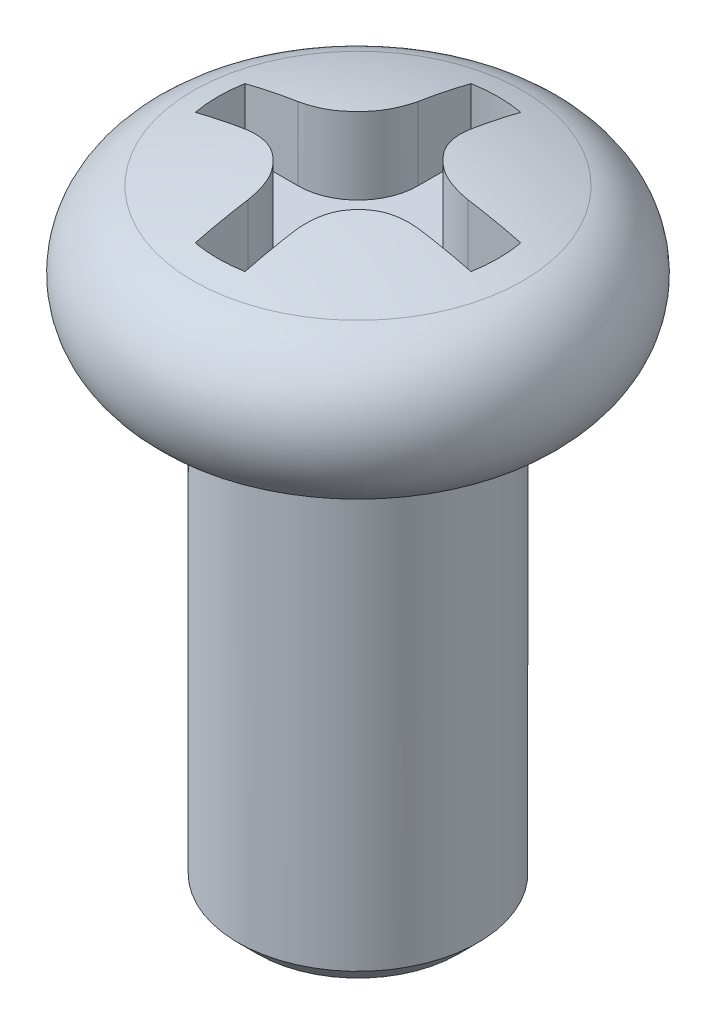
ISO-10303-21;
HEADER;
FILE_DESCRIPTION(('STEP AP214'),'2;1');
FILE_NAME('part.step','',(''),(''),'','','');
FILE_SCHEMA(('AUTOMOTIVE_DESIGN { 1 0 10303 214 1 1 1 1 }'));
ENDSEC;
DATA;
#1=APPLICATION_CONTEXT('core data for automotive mechanical design processes');
#2=APPLICATION_PROTOCOL_DEFINITION('international standard','automotive_design',2000,#1);
#3=PRODUCT_CONTEXT('',#1,'mechanical');
#4=PRODUCT('Part','Part','',(#3));
#5=PRODUCT_RELATED_PRODUCT_CATEGORY('part','',(#4));
#6=PRODUCT_DEFINITION_FORMATION('','',#4);
#7=PRODUCT_DEFINITION_CONTEXT('part definition',#1,'design');
#8=PRODUCT_DEFINITION('design','',#6,#7);
#9=PRODUCT_DEFINITION_SHAPE('','',#8);
#10=(LENGTH_UNIT() NAMED_UNIT(*) SI_UNIT(.MILLI.,.METRE.));
#11=(NAMED_UNIT(*) PLANE_ANGLE_UNIT() SI_UNIT($,.RADIAN.));
#12=(NAMED_UNIT(*) SI_UNIT($,.STERADIAN.) SOLID_ANGLE_UNIT());
#13=UNCERTAINTY_MEASURE_WITH_UNIT(LENGTH_MEASURE(1.E-05),#10,'distance_accuracy_value','');
#14=(GEOMETRIC_REPRESENTATION_CONTEXT(3) GLOBAL_UNCERTAINTY_ASSIGNED_CONTEXT((#13)) GLOBAL_UNIT_ASSIGNED_CONTEXT((#10,
#11,#12)) REPRESENTATION_CONTEXT('',''));
#15=CARTESIAN_POINT('',(0.,0.,0.));
#16=DIRECTION('',(0.,0.,1.));
#17=DIRECTION('',(1.,0.,0.));
#18=AXIS2_PLACEMENT_3D('',#15,#16,#17);
#19=CARTESIAN_POINT('',(0.,-4.9,0.));
#20=DIRECTION('',(0.,-1.,0.));
#21=DIRECTION('',(-1.,0.,0.));
#22=AXIS2_PLACEMENT_3D('',#19,#20,#21);
#23=SPHERICAL_SURFACE('',#22,6.9);
#24=CARTESIAN_POINT('',(0.,1.685838131098,0.));
#25=DIRECTION('',(0.,-1.,0.));
#26=DIRECTION('',(1.,0.,0.));
#27=AXIS2_PLACEMENT_3D('',#24,#25,#26);
#28=CIRCLE('',#27,2.0583333);
#29=CARTESIAN_POINT('',(2.0583333,1.685838131098,0.));
#30=VERTEX_POINT('',#29);
#31=EDGE_CURVE('E202',#30,#30,#28,.T.);
#32=ORIENTED_EDGE('',*,*,#31,.F.);
#33=EDGE_LOOP('',(#32));
#34=FACE_BOUND('',#33,.T.);
#35=CARTESIAN_POINT('',(0.,1.774391358029,0.));
#36=DIRECTION('',(0.,-1.,0.));
#37=DIRECTION('',(0.98411717531384,0.,-0.177520098164429));
#38=AXIS2_PLACEMENT_3D('',#35,#36,#37);
#39=CIRCLE('',#38,1.75);
#40=CARTESIAN_POINT('',(1.722205056801,1.774391358019,-0.3106601717798));
#41=VERTEX_POINT('',#40);
#42=CARTESIAN_POINT('',(1.722205056801,1.774391358019,0.3106601717798));
#43=VERTEX_POINT('',#42);
#44=EDGE_CURVE('E11',#41,#43,#39,.T.);
#45=ORIENTED_EDGE('',*,*,#44,.T.);
#46=CARTESIAN_POINT('',(0.,-4.90000000001,0.3106601717898));
#47=DIRECTION('',(0.,0.,1.));
#48=DIRECTION('',(0.249848296689616,0.968284993502067,0.));
#49=AXIS2_PLACEMENT_3D('',#46,#47,#48);
#50=CIRCLE('',#49,6.893003);
#51=CARTESIAN_POINT('',(1.06066017178,1.910909649795,0.3106601717798));
#52=VERTEX_POINT('',#51);
#53=EDGE_CURVE('E28',#43,#52,#50,.T.);
#54=ORIENTED_EDGE('',*,*,#53,.T.);
#55=CARTESIAN_POINT('',(1.06066017178817,1.9109096497932,0.310660171789263));
#56=CARTESIAN_POINT('',(1.04550870320732,1.91324862458975,0.311111787621939));
#57=CARTESIAN_POINT('',(1.03035536587315,1.91552093768576,0.311893525613119));
#58=CARTESIAN_POINT('',(1.00072540382788,1.91983187100458,0.314097791161661));
#59=CARTESIAN_POINT('',(0.986247474430137,1.92187632437621,0.315491575266336));
#60=CARTESIAN_POINT('',(0.957958898957418,1.92574823588498,0.318863072570291));
#61=CARTESIAN_POINT('',(0.944145807435469,1.92758120480064,0.320813749352214));
#62=CARTESIAN_POINT('',(0.917173875311545,1.93104553982171,0.325254997721349));
#63=CARTESIAN_POINT('',(0.904011515069517,1.93268209941558,0.327720030994574));
#64=CARTESIAN_POINT('',(0.87832295518821,1.93576796378264,0.333155898371454));
#65=CARTESIAN_POINT('',(0.865792279041803,1.93722212794882,0.336102708871264));
#66=CARTESIAN_POINT('',(0.841344070084947,1.93995644697999,0.342478129191438));
#67=CARTESIAN_POINT('',(0.829421234436119,1.94124109577703,0.345884380665194));
#68=CARTESIAN_POINT('',(0.806160237493415,1.94364855747499,0.3531639830369));
#69=CARTESIAN_POINT('',(0.794816156086996,1.94477544280584,0.35701698968363));
#70=CARTESIAN_POINT('',(0.772678127746766,1.94687849678631,0.365183955471231));
#71=CARTESIAN_POINT('',(0.761877982776778,1.94785823003055,0.369480134767831));
#72=CARTESIAN_POINT('',(0.740786369598739,1.94967707488655,0.378534906746319));
#73=CARTESIAN_POINT('',(0.730488947659178,1.95051912353703,0.383279002369331));
#74=CARTESIAN_POINT('',(0.710353384605326,1.9520717023793,0.393237627300516));
#75=CARTESIAN_POINT('',(0.700510258390167,1.9527843940926,0.398441722660219));
#76=CARTESIAN_POINT('',(0.681224835273873,1.9540863929173,0.409333848356008));
#77=CARTESIAN_POINT('',(0.671779396137265,1.95467692749977,0.415016166047504));
#78=CARTESIAN_POINT('',(0.653220654134605,1.95574178825182,0.426882584257356));
#79=CARTESIAN_POINT('',(0.644106921643997,1.95621626964906,0.433065999618065));
#80=CARTESIAN_POINT('',(0.6261318658096,1.95705517853008,0.445955968670018));
#81=CARTESIAN_POINT('',(0.617273441085499,1.95741860893671,0.45266661861116));
#82=CARTESIAN_POINT('',(0.599716795320436,1.95804059516741,0.466634001691271));
#83=CARTESIAN_POINT('',(0.591024880657963,1.95829701176932,0.473898725523823));
#84=CARTESIAN_POINT('',(0.573698973283935,1.95870862426126,0.489000456929484));
#85=CARTESIAN_POINT('',(0.565074133006807,1.95886063560617,0.496847994016686));
#86=CARTESIAN_POINT('',(0.547759027211177,1.95906722149787,0.513131149072098));
#87=CARTESIAN_POINT('',(0.539079140264948,1.95911779880955,0.521577772810033));
#88=CARTESIAN_POINT('',(0.522223726113186,1.95911845324368,0.538436616029811));
#89=CARTESIAN_POINT('',(0.514040924167903,1.95907164587777,0.546841538384985));
#90=CARTESIAN_POINT('',(0.498286766063232,1.95887072332485,0.563676342707573));
#91=CARTESIAN_POINT('',(0.49070407259443,1.958720326036,0.572095577078988));
#92=CARTESIAN_POINT('',(0.476112251744303,1.95831251253911,0.589057461349643));
#93=CARTESIAN_POINT('',(0.469093588667021,1.95805782843146,0.597591940633899));
#94=CARTESIAN_POINT('',(0.455596703912735,1.95743939861879,0.614878142768779));
#95=CARTESIAN_POINT('',(0.449112152870233,1.95707727703771,0.623624964317576));
#96=CARTESIAN_POINT('',(0.436646290125789,1.95624129930515,0.641414800350118));
#97=CARTESIAN_POINT('',(0.430663121190871,1.95576788271336,0.650456532089738));
#98=CARTESIAN_POINT('',(0.419163970664759,1.95470544636917,0.66890506016509));
#99=CARTESIAN_POINT('',(0.413651164909979,1.95411571810024,0.678313795265114));
#100=CARTESIAN_POINT('',(0.403059406441995,1.95281560296707,0.697555977344867));
#101=CARTESIAN_POINT('',(0.397988551103728,1.95210347942657,0.7073937574467));
#102=CARTESIAN_POINT('',(0.388252298114528,1.95055222672741,0.727545960522783));
#103=CARTESIAN_POINT('',(0.383599289917111,1.94971049738361,0.737866152949614));
#104=CARTESIAN_POINT('',(0.374676824706521,1.94789237566674,0.759028293380499));
#105=CARTESIAN_POINT('',(0.370423157610175,1.94691268883952,0.769876591609235));
#106=CARTESIAN_POINT('',(0.362285111445842,1.94480969492859,0.792133948715132));
#107=CARTESIAN_POINT('',(0.358419015033906,1.94368254480411,0.803549300865503));
#108=CARTESIAN_POINT('',(0.351050231439664,1.94127440414978,0.826974208933473));
#109=CARTESIAN_POINT('',(0.347567560938652,1.93998913187359,0.838989592325659));
#110=CARTESIAN_POINT('',(0.340968617672086,1.93725330569677,0.863642930407083));
#111=CARTESIAN_POINT('',(0.337873560688332,1.93579810507451,0.876286021306659));
#112=CARTESIAN_POINT('',(0.332061955673466,1.9327098042312,0.902218478786069));
#113=CARTESIAN_POINT('',(0.32936751404072,1.93107173622393,0.915512184137327));
#114=CARTESIAN_POINT('',(0.324378756877738,1.92760392138918,0.942765366998293));
#115=CARTESIAN_POINT('',(0.322107333345456,1.92576890679366,0.956728346354404));
#116=CARTESIAN_POINT('',(0.317995179547716,1.92189235110058,0.98533534072101));
#117=CARTESIAN_POINT('',(0.316178140485245,1.91984525149653,0.999981987317798));
#118=CARTESIAN_POINT('',(0.313017210390912,1.91552835783761,1.02996879904873));
#119=CARTESIAN_POINT('',(0.311698056950179,1.91325270230791,1.04531074049405));
#120=CARTESIAN_POINT('',(0.310660171789266,1.9109096497932,1.06066017178817));
#121=B_SPLINE_CURVE_WITH_KNOTS('',3,(#55,#56,#57,#58,#59,#60,#61,#62,#63,#64,#65,#66,#67,#68,
#69,#70,#71,#72,#73,#74,#75,#76,#77,#78,#79,#80,#81,#82,#83,#84,#85,#86,#87,#88,#89,#90,#91,#92,
#93,#94,#95,#96,#97,#98,#99,#100,#101,#102,#103,#104,#105,#106,#107,#108,#109,#110,#111,#112,
#113,#114,#115,#116,#117,#118,#119,#120),.UNSPECIFIED.,.F.,.F.,(4,2,2,2,2,2,2,2,2,2,2,2,2,2,2,2,
2,2,2,2,2,2,2,2,2,2,2,2,2,2,2,2,4),(0.,0.0460110378276426,0.0900602395785725,0.132256060055777,
0.1727144070444,0.211563202319611,0.248947053682671,0.285031854204781,0.320008997112121,
0.35409874668017,0.387552182372905,0.420651112884498,0.453705526596246,0.487048545807975,
0.521029408986188,0.556005515994399,0.59233480283093,0.627519739151055,0.661503508456022,
0.694648776266983,0.727316517114937,0.75985734228012,0.792602879788762,0.825858581197161,
0.859898930887623,0.894965400264535,0.931266904252637,0.968982167585572,1.00826331894341,
1.04924012003679,1.092024400231,1.13671443071602,1.18339910029144),.UNSPECIFIED.);
#122=CARTESIAN_POINT('',(0.3106601717798,1.910909649795,1.06066017178));
#123=VERTEX_POINT('',#122);
#124=EDGE_CURVE('E254',#52,#123,#121,.T.);
#125=ORIENTED_EDGE('',*,*,#124,.T.);
#126=CARTESIAN_POINT('',(0.3106601717898,-4.90000000001,0.));
#127=DIRECTION('',(1.,0.,0.));
#128=DIRECTION('',(0.,0.988090336967111,0.153874903711495));
#129=AXIS2_PLACEMENT_3D('',#126,#127,#128);
#130=CIRCLE('',#129,6.893003);
#131=CARTESIAN_POINT('',(0.3106601717798,1.774391358019,1.722205056801));
#132=VERTEX_POINT('',#131);
#133=EDGE_CURVE('E238',#123,#132,#130,.T.);
#134=ORIENTED_EDGE('',*,*,#133,.T.);
#135=CARTESIAN_POINT('',(0.,1.774391358029,0.));
#136=DIRECTION('',(0.,-1.,0.));
#137=DIRECTION('',(0.177520098164429,0.,0.98411717531384));
#138=AXIS2_PLACEMENT_3D('',#135,#136,#137);
#139=CIRCLE('',#138,1.75);
#140=CARTESIAN_POINT('',(-0.3106601717798,1.774391358019,1.722205056801));
#141=VERTEX_POINT('',#140);
#142=EDGE_CURVE('E234',#132,#141,#139,.T.);
#143=ORIENTED_EDGE('',*,*,#142,.T.);
#144=CARTESIAN_POINT('',(-0.3106601717898,-4.90000000001,0.));
#145=DIRECTION('',(-1.,0.,0.));
#146=DIRECTION('',(0.,0.968284993502067,0.249848296689616));
#147=AXIS2_PLACEMENT_3D('',#144,#145,#146);
#148=CIRCLE('',#147,6.893003);
#149=CARTESIAN_POINT('',(-0.3106601717798,1.910909649795,1.06066017178));
#150=VERTEX_POINT('',#149);
#151=EDGE_CURVE('E239',#141,#150,#148,.T.);
#152=ORIENTED_EDGE('',*,*,#151,.T.);
#153=CARTESIAN_POINT('',(-0.310660171789267,1.9109096497932,1.06066017178817));
#154=CARTESIAN_POINT('',(-0.311188959712345,1.91324896499424,1.04548390526636));
#155=CARTESIAN_POINT('',(-0.312041539827203,1.91552149928511,1.03030723466459));
#156=CARTESIAN_POINT('',(-0.314372077221455,1.91983282318091,1.00063316848176));
#157=CARTESIAN_POINT('',(-0.315821831353506,1.92187744705781,0.986134390865545));
#158=CARTESIAN_POINT('',(-0.319291452112784,1.92574965317296,0.95780646007031));
#159=CARTESIAN_POINT('',(-0.321284731114342,1.92758275001018,0.943974826492366));
#160=CARTESIAN_POINT('',(-0.325798908226802,1.93104729519845,0.916968050413905));
#161=CARTESIAN_POINT('',(-0.328294620733991,1.93268394457546,0.90378938381432));
#162=CARTESIAN_POINT('',(-0.333780983965999,1.93576994307483,0.87807046099126));
#163=CARTESIAN_POINT('',(-0.33674786441688,1.9372241639117,0.865525742018178));
#164=CARTESIAN_POINT('',(-0.343153870053884,1.93995854925479,0.841051799416627));
#165=CARTESIAN_POINT('',(-0.346570785680732,1.9412432261917,0.829117291903155));
#166=CARTESIAN_POINT('',(-0.353863364348708,1.94365069369274,0.80583548873411));
#167=CARTESIAN_POINT('',(-0.357718723147978,1.94477758296721,0.794482282697906));
#168=CARTESIAN_POINT('',(-0.365883143588718,1.94688058875411,0.772328806026146));
#169=CARTESIAN_POINT('',(-0.370174355961316,1.94786030554355,0.76152232228317));
#170=CARTESIAN_POINT('',(-0.379212948188262,1.94967905377784,0.740421171798701));
#171=CARTESIAN_POINT('',(-0.383945659036373,1.95052106854347,0.730120496388603));
#172=CARTESIAN_POINT('',(-0.393876175416661,1.95207350655421,0.709981983354731));
#173=CARTESIAN_POINT('',(-0.399063290836236,1.95278614835346,0.700139054866896));
#174=CARTESIAN_POINT('',(-0.409916920659951,1.95408796538572,0.680858071530588));
#175=CARTESIAN_POINT('',(-0.415577413729547,1.95467843430211,0.671416716362742));
#176=CARTESIAN_POINT('',(-0.427396368067784,1.95574307200828,0.652870761102481));
#177=CARTESIAN_POINT('',(-0.433553825350038,1.95621746784146,0.643765533655578));
#178=CARTESIAN_POINT('',(-0.446388634746637,1.9570561174188,0.625812683999315));
#179=CARTESIAN_POINT('',(-0.453069799486907,1.95741944635292,0.616967751061776));
#180=CARTESIAN_POINT('',(-0.466975709447833,1.9580411143769,0.599444149195068));
#181=CARTESIAN_POINT('',(-0.474208239360027,1.95829738077092,0.590771608493482));
#182=CARTESIAN_POINT('',(-0.489242903961644,1.95870869273976,0.573490552519557));
#183=CARTESIAN_POINT('',(-0.497055440351344,1.95886061360104,0.564891059941781));
#184=CARTESIAN_POINT('',(-0.513269250700217,1.95906660303295,0.547636286436078));
#185=CARTESIAN_POINT('',(-0.521681613602266,1.95911670599317,0.538991455897039));
#186=CARTESIAN_POINT('',(-0.538571460417978,1.95911768127167,0.522097027638848));
#187=CARTESIAN_POINT('',(-0.547044521074045,1.95907045827474,0.513843016916012));
#188=CARTESIAN_POINT('',(-0.56399876143187,1.95886899341761,0.497947572320779));
#189=CARTESIAN_POINT('',(-0.572469283228695,1.95871855400853,0.49029480975597));
#190=CARTESIAN_POINT('',(-0.589521670931856,1.95831048507428,0.475568249656966));
#191=CARTESIAN_POINT('',(-0.59809508439007,1.95805570890199,0.468484628581978));
#192=CARTESIAN_POINT('',(-0.61544809320584,1.95743700946711,0.454863885615258));
#193=CARTESIAN_POINT('',(-0.624222401774775,1.95707484692545,0.448319973267337));
#194=CARTESIAN_POINT('',(-0.642057759032678,1.95623865863534,0.435742951941135));
#195=CARTESIAN_POINT('',(-0.651117104272223,1.95576521675466,0.429707392920342));
#196=CARTESIAN_POINT('',(-0.669592513013881,1.95470260623423,0.418112272203229));
#197=CARTESIAN_POINT('',(-0.679010137324107,1.95411286925276,0.412555248845126));
#198=CARTESIAN_POINT('',(-0.698262685378216,1.95281262136386,0.401885167156466));
#199=CARTESIAN_POINT('',(-0.708101656304477,1.95210050003572,0.396779616806807));
#200=CARTESIAN_POINT('',(-0.728249568391864,1.95054915655108,0.386985405622301));
#201=CARTESIAN_POINT('',(-0.738564101287168,1.94970744067116,0.382308671875041));
#202=CARTESIAN_POINT('',(-0.759708866785122,1.94788927485507,0.373351596663143));
#203=CARTESIAN_POINT('',(-0.770545370238492,1.94690961535292,0.369086762829485));
#204=CARTESIAN_POINT('',(-0.792773604774974,1.94480663004744,0.360940770248744));
#205=CARTESIAN_POINT('',(-0.804171623252446,1.94367952585863,0.357077817335521));
#206=CARTESIAN_POINT('',(-0.827556777049572,1.94127145393799,0.349731436870132));
#207=CARTESIAN_POINT('',(-0.839549778045758,1.93998625185881,0.346268158862058));
#208=CARTESIAN_POINT('',(-0.864153632900593,1.93725056276809,0.339726060043669));
#209=CARTESIAN_POINT('',(-0.876769677308417,1.9357954625907,0.336668789293999));
#210=CARTESIAN_POINT('',(-0.90264360191056,1.93270737593054,0.330952994968485));
#211=CARTESIAN_POINT('',(-0.9159058671021,1.93106944447769,0.328317100461364));
#212=CARTESIAN_POINT('',(-0.943091898136948,1.9276019304221,0.323468092772859));
#213=CARTESIAN_POINT('',(-0.957019183113387,1.92576709464389,0.321278569545032));
#214=CARTESIAN_POINT('',(-0.98555054505602,1.92189093524492,0.317355556253512));
#215=CARTESIAN_POINT('',(-1.00015722313923,1.91984406124985,0.315646621982165));
#216=CARTESIAN_POINT('',(-1.03005971711726,1.91552767327938,0.312730083833179));
#217=CARTESIAN_POINT('',(-1.04535721296255,1.91325230108314,0.31154823924848));
#218=CARTESIAN_POINT('',(-1.06066017178817,1.9109096497932,0.310660171789262));
#219=B_SPLINE_CURVE_WITH_KNOTS('',3,(#153,#154,#155,#156,#157,#158,#159,#160,#161,#162,#163,
#164,#165,#166,#167,#168,#169,#170,#171,#172,#173,#174,#175,#176,#177,#178,#179,#180,#181,#182,
#183,#184,#185,#186,#187,#188,#189,#190,#191,#192,#193,#194,#195,#196,#197,#198,#199,#200,#201,
#202,#203,#204,#205,#206,#207,#208,#209,#210,#211,#212,#213,#214,#215,#216,#217,#218),
.UNSPECIFIED.,.F.,.F.,(4,2,2,2,2,2,2,2,2,2,2,2,2,2,2,2,2,2,2,2,2,2,2,2,2,2,2,2,2,2,2,2,4),(0.,
0.0460921786748148,0.0902198498512771,0.132488705002184,0.173012160610234,0.211915867973418,
0.249342345064399,0.285455552834279,0.320445110356938,0.35452969285542,0.387959027994639,
0.421013876330516,0.454003541733871,0.487260852899496,0.521135118579409,0.555984085799017,
0.592166182179417,0.627646915995433,0.661886164147461,0.6952457010258,0.728085961939722,
0.760757616351991,0.79359308354668,0.826899346063419,0.860953061358756,0.895998366725662,
0.932247189387749,0.969881506793647,1.00905689084824,1.04990674208378,1.09254677446084,
1.1370794723804,1.18359837042956),.UNSPECIFIED.);
#220=CARTESIAN_POINT('',(-1.06066017178,1.910909649795,0.3106601717798));
#221=VERTEX_POINT('',#220);
#222=EDGE_CURVE('E575',#150,#221,#219,.T.);
#223=ORIENTED_EDGE('',*,*,#222,.T.);
#224=CARTESIAN_POINT('',(0.,-4.90000000001,0.3106601717898));
#225=DIRECTION('',(0.,0.,1.));
#226=DIRECTION('',(-0.153874903711495,0.988090336967111,0.));
#227=AXIS2_PLACEMENT_3D('',#224,#225,#226);
#228=CIRCLE('',#227,6.893003);
#229=CARTESIAN_POINT('',(-1.722205056801,1.774391358019,0.3106601717798));
#230=VERTEX_POINT('',#229);
#231=EDGE_CURVE('E139',#221,#230,#228,.T.);
#232=ORIENTED_EDGE('',*,*,#231,.T.);
#233=CARTESIAN_POINT('',(0.,1.774391358029,0.));
#234=DIRECTION('',(0.,-1.,0.));
#235=DIRECTION('',(-1.,0.,0.));
#236=AXIS2_PLACEMENT_3D('',#233,#234,#235);
#237=CIRCLE('',#236,1.75);
#238=CARTESIAN_POINT('',(-1.722205056801,1.774391358019,-0.3106601717798));
#239=VERTEX_POINT('',#238);
#240=EDGE_CURVE('E433',#230,#239,#237,.T.);
#241=ORIENTED_EDGE('',*,*,#240,.T.);
#242=CARTESIAN_POINT('',(0.,-4.90000000001,-0.3106601717898));
#243=DIRECTION('',(0.,0.,-1.));
#244=DIRECTION('',(-0.249848296689616,0.968284993502067,0.));
#245=AXIS2_PLACEMENT_3D('',#242,#243,#244);
#246=CIRCLE('',#245,6.893003);
#247=CARTESIAN_POINT('',(-1.06066017178,1.910909649795,-0.3106601717798));
#248=VERTEX_POINT('',#247);
#249=EDGE_CURVE('E308',#239,#248,#246,.T.);
#250=ORIENTED_EDGE('',*,*,#249,.T.);
#251=CARTESIAN_POINT('',(-1.06066017178817,1.9109096497932,-0.310660171789264));
#252=CARTESIAN_POINT('',(-1.04550870320732,1.91324862458975,-0.311111787621942));
#253=CARTESIAN_POINT('',(-1.03035536587314,1.91552093768576,-0.311893525613123));
#254=CARTESIAN_POINT('',(-1.00072540382788,1.91983187100458,-0.314097791161667));
#255=CARTESIAN_POINT('',(-0.986247474430135,1.92187632437621,-0.315491575266344));
#256=CARTESIAN_POINT('',(-0.957958898957415,1.92574823588498,-0.3188630725703));
#257=CARTESIAN_POINT('',(-0.944145807435466,1.92758120480064,-0.320813749352224));
#258=CARTESIAN_POINT('',(-0.917173875311541,1.93104553982171,-0.325254997721361));
#259=CARTESIAN_POINT('',(-0.904011515069513,1.93268209941558,-0.327720030994586));
#260=CARTESIAN_POINT('',(-0.878322955188205,1.93576796378264,-0.333155898371467));
#261=CARTESIAN_POINT('',(-0.865792279041798,1.93722212794882,-0.336102708871277));
#262=CARTESIAN_POINT('',(-0.841344070084941,1.93995644697999,-0.342478129191452));
#263=CARTESIAN_POINT('',(-0.829421234436113,1.94124109577703,-0.345884380665208));
#264=CARTESIAN_POINT('',(-0.806160237493409,1.94364855747499,-0.353163983036915));
#265=CARTESIAN_POINT('',(-0.794816156086989,1.94477544280584,-0.357016989683644));
#266=CARTESIAN_POINT('',(-0.772678127746759,1.94687849678631,-0.365183955471245));
#267=CARTESIAN_POINT('',(-0.761877982776771,1.94785823003055,-0.369480134767846));
#268=CARTESIAN_POINT('',(-0.740786369598732,1.94967707488655,-0.378534906746334));
#269=CARTESIAN_POINT('',(-0.730488947659171,1.95051912353703,-0.383279002369345));
#270=CARTESIAN_POINT('',(-0.710353384605319,1.9520717023793,-0.39323762730053));
#271=CARTESIAN_POINT('',(-0.700510258390159,1.9527843940926,-0.398441722660233));
#272=CARTESIAN_POINT('',(-0.681224835273866,1.9540863929173,-0.409333848356021));
#273=CARTESIAN_POINT('',(-0.671779396137257,1.95467692749977,-0.415016166047517));
#274=CARTESIAN_POINT('',(-0.653220654134597,1.95574178825182,-0.426882584257368));
#275=CARTESIAN_POINT('',(-0.644106921643989,1.95621626964906,-0.433065999618076));
#276=CARTESIAN_POINT('',(-0.626131865809593,1.95705517853008,-0.445955968670029));
#277=CARTESIAN_POINT('',(-0.617273441085492,1.95741860893671,-0.45266661861117));
#278=CARTESIAN_POINT('',(-0.599716795320429,1.95804059516741,-0.466634001691281));
#279=CARTESIAN_POINT('',(-0.591024880657956,1.95829701176932,-0.473898725523832));
#280=CARTESIAN_POINT('',(-0.573698973283929,1.95870862426126,-0.489000456929491));
#281=CARTESIAN_POINT('',(-0.565074133006801,1.95886063560617,-0.496847994016693));
#282=CARTESIAN_POINT('',(-0.547759027211172,1.95906722149787,-0.513131149072103));
#283=CARTESIAN_POINT('',(-0.539079140264943,1.95911779880955,-0.521577772810038));
#284=CARTESIAN_POINT('',(-0.522223726113182,1.95911845324368,-0.538436616029815));
#285=CARTESIAN_POINT('',(-0.514040924167899,1.95907164587777,-0.546841538384989));
#286=CARTESIAN_POINT('',(-0.498286766063229,1.95887072332485,-0.563676342707576));
#287=CARTESIAN_POINT('',(-0.490704072594427,1.958720326036,-0.572095577078991));
#288=CARTESIAN_POINT('',(-0.476112251744301,1.95831251253911,-0.589057461349645));
#289=CARTESIAN_POINT('',(-0.469093588667019,1.95805782843146,-0.5975919406339));
#290=CARTESIAN_POINT('',(-0.455596703912733,1.95743939861879,-0.61487814276878));
#291=CARTESIAN_POINT('',(-0.449112152870231,1.95707727703771,-0.623624964317577));
#292=CARTESIAN_POINT('',(-0.436646290125787,1.95624129930515,-0.641414800350119));
#293=CARTESIAN_POINT('',(-0.430663121190869,1.95576788271336,-0.650456532089739));
#294=CARTESIAN_POINT('',(-0.419163970664759,1.95470544636917,-0.66890506016509));
#295=CARTESIAN_POINT('',(-0.413651164909979,1.95411571810024,-0.678313795265114));
#296=CARTESIAN_POINT('',(-0.403059406441995,1.95281560296707,-0.697555977344867));
#297=CARTESIAN_POINT('',(-0.397988551103728,1.95210347942657,-0.7073937574467));
#298=CARTESIAN_POINT('',(-0.388252298114528,1.95055222672741,-0.727545960522783));
#299=CARTESIAN_POINT('',(-0.383599289917112,1.94971049738361,-0.737866152949614));
#300=CARTESIAN_POINT('',(-0.374676824706521,1.94789237566674,-0.759028293380498));
#301=CARTESIAN_POINT('',(-0.370423157610176,1.94691268883952,-0.769876591609235));
#302=CARTESIAN_POINT('',(-0.362285111445843,1.94480969492859,-0.792133948715132));
#303=CARTESIAN_POINT('',(-0.358419015033907,1.94368254480411,-0.803549300865503));
#304=CARTESIAN_POINT('',(-0.351050231439665,1.94127440414978,-0.826974208933473));
#305=CARTESIAN_POINT('',(-0.347567560938653,1.93998913187359,-0.838989592325658));
#306=CARTESIAN_POINT('',(-0.340968617672086,1.93725330569677,-0.863642930407083));
#307=CARTESIAN_POINT('',(-0.337873560688333,1.93579810507451,-0.876286021306659));
#308=CARTESIAN_POINT('',(-0.332061955673466,1.9327098042312,-0.902218478786069));
#309=CARTESIAN_POINT('',(-0.329367514040721,1.93107173622393,-0.915512184137327));
#310=CARTESIAN_POINT('',(-0.324378756877739,1.92760392138918,-0.942765366998293));
#311=CARTESIAN_POINT('',(-0.322107333345456,1.92576890679366,-0.956728346354403));
#312=CARTESIAN_POINT('',(-0.317995179547716,1.92189235110058,-0.98533534072101));
#313=CARTESIAN_POINT('',(-0.316178140485245,1.91984525149653,-0.999981987317798));
#314=CARTESIAN_POINT('',(-0.313017210390911,1.91552835783761,-1.02996879904873));
#315=CARTESIAN_POINT('',(-0.311698056950178,1.91325270230791,-1.04531074049405));
#316=CARTESIAN_POINT('',(-0.310660171789264,1.9109096497932,-1.06066017178817));
#317=B_SPLINE_CURVE_WITH_KNOTS('',3,(#251,#252,#253,#254,#255,#256,#257,#258,#259,#260,#261,
#262,#263,#264,#265,#266,#267,#268,#269,#270,#271,#272,#273,#274,#275,#276,#277,#278,#279,#280,
#281,#282,#283,#284,#285,#286,#287,#288,#289,#290,#291,#292,#293,#294,#295,#296,#297,#298,#299,
#300,#301,#302,#303,#304,#305,#306,#307,#308,#309,#310,#311,#312,#313,#314,#315,#316),
.UNSPECIFIED.,.F.,.F.,(4,2,2,2,2,2,2,2,2,2,2,2,2,2,2,2,2,2,2,2,2,2,2,2,2,2,2,2,2,2,2,2,4),(0.,
0.046011037827644,0.0900602395785753,0.132256060055781,0.172714407044405,0.211563202319617,
0.248947053682678,0.285031854204789,0.320008997112129,0.354098746680178,0.387552182372914,
0.420651112884505,0.453705526596253,0.487048545807981,0.521029408986192,0.556005515994401,
0.592334802830931,0.627519739151054,0.661503508456019,0.694648776266979,0.727316517114933,
0.759857342280115,0.792602879788757,0.825858581197155,0.859898930887617,0.894965400264528,
0.93126690425263,0.968982167585566,1.0082633189434,1.04924012003679,1.092024400231,
1.13671443071602,1.18339910029144),.UNSPECIFIED.);
#318=CARTESIAN_POINT('',(-0.3106601717798,1.910909649795,-1.06066017178));
#319=VERTEX_POINT('',#318);
#320=EDGE_CURVE('E302',#248,#319,#317,.T.);
#321=ORIENTED_EDGE('',*,*,#320,.T.);
#322=CARTESIAN_POINT('',(-0.3106601717898,-4.90000000001,0.));
#323=DIRECTION('',(-1.,0.,0.));
#324=DIRECTION('',(0.,0.988090336967111,-0.153874903711495));
#325=AXIS2_PLACEMENT_3D('',#322,#323,#324);
#326=CIRCLE('',#325,6.893003);
#327=CARTESIAN_POINT('',(-0.3106601717798,1.774391358019,-1.722205056801));
#328=VERTEX_POINT('',#327);
#329=EDGE_CURVE('E438',#319,#328,#326,.T.);
#330=ORIENTED_EDGE('',*,*,#329,.T.);
#331=CARTESIAN_POINT('',(0.,1.774391358029,0.));
#332=DIRECTION('',(0.,-1.,0.));
#333=DIRECTION('',(-0.177520098164429,0.,-0.98411717531384));
#334=AXIS2_PLACEMENT_3D('',#331,#332,#333);
#335=CIRCLE('',#334,1.75);
#336=CARTESIAN_POINT('',(0.3106601717798,1.774391358019,-1.722205056801));
#337=VERTEX_POINT('',#336);
#338=EDGE_CURVE('E346',#328,#337,#335,.T.);
#339=ORIENTED_EDGE('',*,*,#338,.T.);
#340=CARTESIAN_POINT('',(0.3106601717898,-4.90000000001,0.));
#341=DIRECTION('',(1.,0.,0.));
#342=DIRECTION('',(0.,0.968284993502067,-0.249848296689616));
#343=AXIS2_PLACEMENT_3D('',#340,#341,#342);
#344=CIRCLE('',#343,6.893003);
#345=CARTESIAN_POINT('',(0.3106601717798,1.910909649795,-1.06066017178));
#346=VERTEX_POINT('',#345);
#347=EDGE_CURVE('E337',#337,#346,#344,.T.);
#348=ORIENTED_EDGE('',*,*,#347,.T.);
#349=CARTESIAN_POINT('',(0.310660171789264,1.9109096497932,-1.06066017178817));
#350=CARTESIAN_POINT('',(0.311188959712349,1.91324896499427,-1.0454839052662));
#351=CARTESIAN_POINT('',(0.312041539827208,1.91552149928516,-1.03030723466428));
#352=CARTESIAN_POINT('',(0.314372077221454,1.91983282318099,-1.00063316848116));
#353=CARTESIAN_POINT('',(0.315821831353499,1.92187744705792,-0.986134390864814));
#354=CARTESIAN_POINT('',(0.319291452112756,1.9257496531731,-0.957806460069334));
#355=CARTESIAN_POINT('',(0.3212847311143,1.92758275001033,-0.943974826491279));
#356=CARTESIAN_POINT('',(0.325798908226727,1.93104729519863,-0.916968050412615));
#357=CARTESIAN_POINT('',(0.328294620733895,1.93268394457564,-0.903789383812939));
#358=CARTESIAN_POINT('',(0.33378098396586,1.93576994307504,-0.87807046098972));
#359=CARTESIAN_POINT('',(0.336747864416715,1.93722416391192,-0.865525742016568));
#360=CARTESIAN_POINT('',(0.34315387005367,1.93995854925501,-0.841051799414901));
#361=CARTESIAN_POINT('',(0.346570785680491,1.94124322619192,-0.829117291901382));
#362=CARTESIAN_POINT('',(0.353863364348414,1.94365069369298,-0.805835488732264));
#363=CARTESIAN_POINT('',(0.357718723147656,1.94477758296744,-0.794482282696034));
#364=CARTESIAN_POINT('',(0.365883143588343,1.94688058875434,-0.772328806024244));
#365=CARTESIAN_POINT('',(0.370174355960915,1.94786030554378,-0.761522322281264));
#366=CARTESIAN_POINT('',(0.379212948187813,1.94967905377807,-0.740421171796806));
#367=CARTESIAN_POINT('',(0.383945659035902,1.9505210685437,-0.730120496386723));
#368=CARTESIAN_POINT('',(0.393876175416152,1.95207350655443,-0.709981983352904));
#369=CARTESIAN_POINT('',(0.39906329083571,1.95278614835368,-0.700139054865105));
#370=CARTESIAN_POINT('',(0.409916920659402,1.95408796538592,-0.68085807152889));
#371=CARTESIAN_POINT('',(0.41557741372899,1.95467843430231,-0.6714167163611));
#372=CARTESIAN_POINT('',(0.427396368067224,1.95574307200845,-0.652870761100969));
#373=CARTESIAN_POINT('',(0.433553825349481,1.95621746784163,-0.643765533654141));
#374=CARTESIAN_POINT('',(0.446388634746101,1.95705611741895,-0.625812683998044));
#375=CARTESIAN_POINT('',(0.453069799486389,1.95741944635306,-0.616967751060597));
#376=CARTESIAN_POINT('',(0.466975709447367,1.95804111437702,-0.59944414919409));
#377=CARTESIAN_POINT('',(0.474208239359598,1.95829738077103,-0.590771608492614));
#378=CARTESIAN_POINT('',(0.4892429039613,1.95870869273984,-0.573490552518917));
#379=CARTESIAN_POINT('',(0.497055440351052,1.95886061360111,-0.564891059941261));
#380=CARTESIAN_POINT('',(0.513269250700055,1.95906660303298,-0.547636286435813));
#381=CARTESIAN_POINT('',(0.521681613602181,1.95911670599318,-0.538991455896911));
#382=CARTESIAN_POINT('',(0.538571460418095,1.95911768127165,-0.522097027638939));
#383=CARTESIAN_POINT('',(0.547044521074288,1.9590704582747,-0.513843016916186));
#384=CARTESIAN_POINT('',(0.563998761432351,1.95886899341754,-0.497947572321098));
#385=CARTESIAN_POINT('',(0.572469283229291,1.95871855400846,-0.490294809756351));
#386=CARTESIAN_POINT('',(0.589521670932667,1.95831048507418,-0.475568249657449));
#387=CARTESIAN_POINT('',(0.598095084390982,1.95805570890188,-0.468484628582504));
#388=CARTESIAN_POINT('',(0.61544809320694,1.95743700946698,-0.454863885615849));
#389=CARTESIAN_POINT('',(0.624222401775961,1.95707484692531,-0.448319973267952));
#390=CARTESIAN_POINT('',(0.642057759034022,1.95623865863518,-0.435742951941783));
#391=CARTESIAN_POINT('',(0.651117104273638,1.95576521675448,-0.429707392921001));
#392=CARTESIAN_POINT('',(0.669592513015421,1.95470260623403,-0.418112272203897));
#393=CARTESIAN_POINT('',(0.6790101373257,1.95411286925256,-0.412555248845792));
#394=CARTESIAN_POINT('',(0.6982626853799,1.95281262136365,-0.401885167157119));
#395=CARTESIAN_POINT('',(0.708101656306195,1.9521005000355,-0.396779616807447));
#396=CARTESIAN_POINT('',(0.728249568393635,1.95054915655086,-0.386985405622911));
#397=CARTESIAN_POINT('',(0.738564101288954,1.94970744067094,-0.382308671875632));
#398=CARTESIAN_POINT('',(0.759708866786922,1.94788927485484,-0.373351596663691));
#399=CARTESIAN_POINT('',(0.770545370240288,1.94690961535269,-0.369086762830008));
#400=CARTESIAN_POINT('',(0.792773604776743,1.94480663004721,-0.360940770249216));
#401=CARTESIAN_POINT('',(0.804171623254191,1.9436795258584,-0.357077817335966));
#402=CARTESIAN_POINT('',(0.82755677705125,1.94127145393777,-0.349731436870521));
#403=CARTESIAN_POINT('',(0.839549778047391,1.93998625185859,-0.346268158862417));
#404=CARTESIAN_POINT('',(0.864153632902118,1.93725056276788,-0.339726060043971));
#405=CARTESIAN_POINT('',(0.876769677309877,1.9357954625905,-0.336668789294272));
#406=CARTESIAN_POINT('',(0.902643601911869,1.93270737593036,-0.330952994968704));
#407=CARTESIAN_POINT('',(0.915905867103324,1.93106944447752,-0.328317100461556));
#408=CARTESIAN_POINT('',(0.943091898137981,1.92760193042195,-0.323468092773003));
#409=CARTESIAN_POINT('',(0.957019183114314,1.92576709464375,-0.321278569545153));
#410=CARTESIAN_POINT('',(0.985550545056713,1.92189093524482,-0.317355556253591));
#411=CARTESIAN_POINT('',(1.00015722313979,1.91984406124976,-0.315646621982225));
#412=CARTESIAN_POINT('',(1.03005971711755,1.91552767327933,-0.312730083833205));
#413=CARTESIAN_POINT('',(1.04535721296269,1.91325230108311,-0.311548239248492));
#414=CARTESIAN_POINT('',(1.06066017178817,1.9109096497932,-0.310660171789264));
#415=B_SPLINE_CURVE_WITH_KNOTS('',3,(#349,#350,#351,#352,#353,#354,#355,#356,#357,#358,#359,
#360,#361,#362,#363,#364,#365,#366,#367,#368,#369,#370,#371,#372,#373,#374,#375,#376,#377,#378,
#379,#380,#381,#382,#383,#384,#385,#386,#387,#388,#389,#390,#391,#392,#393,#394,#395,#396,#397,
#398,#399,#400,#401,#402,#403,#404,#405,#406,#407,#408,#409,#410,#411,#412,#413,#414),
.UNSPECIFIED.,.F.,.F.,(4,2,2,2,2,2,2,2,2,2,2,2,2,2,2,2,2,2,2,2,2,2,2,2,2,2,2,2,2,2,2,2,4),(0.,
0.0460921786752836,0.0902198498521477,0.132488705003383,0.173012160611691,0.211915867975062,
0.249342345066157,0.285455552836084,0.320445110358727,0.354529692857136,0.387959027996234,
0.421013876331954,0.454003541735127,0.487260852900562,0.521135118580289,0.555984085799733,
0.592166182180003,0.627646915996113,0.661886164148274,0.695245701026769,0.728085961940859,
0.76075761635329,0.793593083548123,0.826899346064974,0.86095306136038,0.895998366727305,
0.93224718938935,0.969881506795144,1.00905689084957,1.04990674208487,1.09254677446162,
1.13707947238081,1.18359837042952),.UNSPECIFIED.);
#416=CARTESIAN_POINT('',(1.06066017178,1.910909649795,-0.3106601717798));
#417=VERTEX_POINT('',#416);
#418=EDGE_CURVE('E347',#346,#417,#415,.T.);
#419=ORIENTED_EDGE('',*,*,#418,.T.);
#420=CARTESIAN_POINT('',(0.,-4.90000000001,-0.3106601717898));
#421=DIRECTION('',(0.,0.,-1.));
#422=DIRECTION('',(0.153874903711495,0.988090336967111,0.));
#423=AXIS2_PLACEMENT_3D('',#420,#421,#422);
#424=CIRCLE('',#423,6.893003);
#425=EDGE_CURVE('E154',#417,#41,#424,.T.);
#426=ORIENTED_EDGE('',*,*,#425,.T.);
#427=EDGE_LOOP('',(#45,#54,#125,#134,#143,#152,#223,#232,#241,#250,#321,#330,#339,#348,#419,#426));
#428=FACE_BOUND('',#427,.T.);
#429=ADVANCED_FACE('F17',(#34,#428),#23,.T.);
#430=CARTESIAN_POINT('',(-1.06066017178,1.,1.06066017178));
#431=DIRECTION('',(0.,1.,0.));
#432=DIRECTION('',(1.,0.,0.));
#433=AXIS2_PLACEMENT_3D('',#430,#431,#432);
#434=CYLINDRICAL_SURFACE('',#433,0.75);
#435=DIRECTION('',(0.,1.,0.));
#436=VECTOR('',#435,1.);
#437=CARTESIAN_POINT('',(-0.3106601717898,1.00000000001,1.06066017179));
#438=LINE('',#437,#436);
#439=CARTESIAN_POINT('',(-0.3106601717798,1.,1.06066017178));
#440=VERTEX_POINT('',#439);
#441=EDGE_CURVE('E149',#440,#150,#438,.T.);
#442=ORIENTED_EDGE('',*,*,#441,.F.);
#443=CARTESIAN_POINT('',(-1.06066017179,1.00000000001,1.06066017179));
#444=DIRECTION('',(0.,1.,0.));
#445=DIRECTION('',(1.,0.,0.));
#446=AXIS2_PLACEMENT_3D('',#443,#444,#445);
#447=CIRCLE('',#446,0.75);
#448=CARTESIAN_POINT('',(-1.06066017178,1.,0.3106601717798));
#449=VERTEX_POINT('',#448);
#450=EDGE_CURVE('E143',#440,#449,#447,.T.);
#451=ORIENTED_EDGE('',*,*,#450,.T.);
#452=DIRECTION('',(0.,1.,0.));
#453=VECTOR('',#452,1.);
#454=CARTESIAN_POINT('',(-1.06066017179,1.00000000001,0.3106601717898));
#455=LINE('',#454,#453);
#456=EDGE_CURVE('E131',#449,#221,#455,.T.);
#457=ORIENTED_EDGE('',*,*,#456,.T.);
#458=ORIENTED_EDGE('',*,*,#222,.F.);
#459=EDGE_LOOP('',(#442,#451,#457,#458));
#460=FACE_BOUND('',#459,.T.);
#461=ADVANCED_FACE('F147',(#460),#434,.T.);
#462=CARTESIAN_POINT('',(-0.3106601717798,1.,1.722205056801));
#463=DIRECTION('',(-1.,0.,0.));
#464=DIRECTION('',(0.,0.,1.));
#465=AXIS2_PLACEMENT_3D('',#462,#463,#464);
#466=PLANE('',#465);
#467=DIRECTION('',(0.,1.,0.));
#468=VECTOR('',#467,1.);
#469=CARTESIAN_POINT('',(-0.3106601717898,1.00000000001,1.722205056811));
#470=LINE('',#469,#468);
#471=CARTESIAN_POINT('',(-0.3106601717798,1.,1.722205056801));
#472=VERTEX_POINT('',#471);
#473=EDGE_CURVE('E192',#472,#141,#470,.T.);
#474=ORIENTED_EDGE('',*,*,#473,.F.);
#475=DIRECTION('',(0.,0.,-1.));
#476=VECTOR('',#475,1.);
#477=CARTESIAN_POINT('',(-0.3106601717898,1.00000000001,1.722205056811));
#478=LINE('',#477,#476);
#479=EDGE_CURVE('E144',#472,#440,#478,.T.);
#480=ORIENTED_EDGE('',*,*,#479,.T.);
#481=ORIENTED_EDGE('',*,*,#441,.T.);
#482=ORIENTED_EDGE('',*,*,#151,.F.);
#483=EDGE_LOOP('',(#474,#480,#481,#482));
#484=FACE_BOUND('',#483,.T.);
#485=ADVANCED_FACE('F469',(#484),#466,.F.);
#486=CARTESIAN_POINT('',(-0.3106601717798,1.,-1.06066017178));
#487=DIRECTION('',(-1.,0.,0.));
#488=DIRECTION('',(0.,0.,1.));
#489=AXIS2_PLACEMENT_3D('',#486,#487,#488);
#490=PLANE('',#489);
#491=DIRECTION('',(0.,1.,0.));
#492=VECTOR('',#491,1.);
#493=CARTESIAN_POINT('',(-0.3106601717898,1.00000000001,-1.06066017179));
#494=LINE('',#493,#492);
#495=CARTESIAN_POINT('',(-0.3106601717798,1.,-1.06066017178));
#496=VERTEX_POINT('',#495);
#497=EDGE_CURVE('E376',#496,#319,#494,.T.);
#498=ORIENTED_EDGE('',*,*,#497,.F.);
#499=DIRECTION('',(0.,0.,-1.));
#500=VECTOR('',#499,1.);
#501=CARTESIAN_POINT('',(-0.3106601717898,1.00000000001,-1.06066017179));
#502=LINE('',#501,#500);
#503=CARTESIAN_POINT('',(-0.3106601717798,1.,-1.722205056801));
#504=VERTEX_POINT('',#503);
#505=EDGE_CURVE('E420',#496,#504,#502,.T.);
#506=ORIENTED_EDGE('',*,*,#505,.T.);
#507=DIRECTION('',(0.,1.,0.));
#508=VECTOR('',#507,1.);
#509=CARTESIAN_POINT('',(-0.3106601717898,1.00000000001,-1.722205056811));
#510=LINE('',#509,#508);
#511=EDGE_CURVE('E177',#504,#328,#510,.T.);
#512=ORIENTED_EDGE('',*,*,#511,.T.);
#513=ORIENTED_EDGE('',*,*,#329,.F.);
#514=EDGE_LOOP('',(#498,#506,#512,#513));
#515=FACE_BOUND('',#514,.T.);
#516=ADVANCED_FACE('F467',(#515),#490,.F.);
#517=CARTESIAN_POINT('',(0.,-5.875,0.));
#518=DIRECTION('',(0.,1.,0.));
#519=DIRECTION('',(1.,0.,0.));
#520=AXIS2_PLACEMENT_3D('',#517,#518,#519);
#521=CONICAL_SURFACE('',#520,1.375,0.7853981634);
#522=CARTESIAN_POINT('',(0.,-5.75000000001,0.));
#523=DIRECTION('',(0.,-1.,0.));
#524=DIRECTION('',(-1.,0.,0.));
#525=AXIS2_PLACEMENT_3D('',#522,#523,#524);
#526=CIRCLE('',#525,1.5);
#527=CARTESIAN_POINT('',(-1.5,-5.75000000001,0.));
#528=VERTEX_POINT('',#527);
#529=EDGE_CURVE('E173',#528,#528,#526,.T.);
#530=ORIENTED_EDGE('',*,*,#529,.T.);
#531=EDGE_LOOP('',(#530));
#532=FACE_BOUND('',#531,.T.);
#533=CARTESIAN_POINT('',(0.,-6.00000000001,0.));
#534=DIRECTION('',(0.,1.,0.));
#535=DIRECTION('',(-1.,0.,0.));
#536=AXIS2_PLACEMENT_3D('',#533,#534,#535);
#537=CIRCLE('',#536,1.25);
#538=CARTESIAN_POINT('',(-1.25,-6.00000000001,0.));
#539=VERTEX_POINT('',#538);
#540=EDGE_CURVE('E178',#539,#539,#537,.T.);
#541=ORIENTED_EDGE('',*,*,#540,.T.);
#542=EDGE_LOOP('',(#541));
#543=FACE_BOUND('',#542,.T.);
#544=ADVANCED_FACE('F328',(#532,#543),#521,.T.);
#545=CARTESIAN_POINT('',(1.06066017178,1.,-1.06066017178));
#546=DIRECTION('',(0.,1.,0.));
#547=DIRECTION('',(1.,0.,0.));
#548=AXIS2_PLACEMENT_3D('',#545,#546,#547);
#549=CYLINDRICAL_SURFACE('',#548,0.75);
#550=DIRECTION('',(0.,1.,0.));
#551=VECTOR('',#550,1.);
#552=CARTESIAN_POINT('',(0.3106601717898,1.00000000001,-1.06066017179));
#553=LINE('',#552,#551);
#554=CARTESIAN_POINT('',(0.3106601717798,1.,-1.06066017178));
#555=VERTEX_POINT('',#554);
#556=EDGE_CURVE('E219',#555,#346,#553,.T.);
#557=ORIENTED_EDGE('',*,*,#556,.F.);
#558=CARTESIAN_POINT('',(1.06066017179,1.00000000001,-1.06066017179));
#559=DIRECTION('',(0.,1.,0.));
#560=DIRECTION('',(-1.,0.,0.));
#561=AXIS2_PLACEMENT_3D('',#558,#559,#560);
#562=CIRCLE('',#561,0.75);
#563=CARTESIAN_POINT('',(1.06066017178,1.,-0.3106601717798));
#564=VERTEX_POINT('',#563);
#565=EDGE_CURVE('E233',#555,#564,#562,.T.);
#566=ORIENTED_EDGE('',*,*,#565,.T.);
#567=DIRECTION('',(0.,1.,0.));
#568=VECTOR('',#567,1.);
#569=CARTESIAN_POINT('',(1.06066017179,1.00000000001,-0.3106601717898));
#570=LINE('',#569,#568);
#571=EDGE_CURVE('E243',#564,#417,#570,.T.);
#572=ORIENTED_EDGE('',*,*,#571,.T.);
#573=ORIENTED_EDGE('',*,*,#418,.F.);
#574=EDGE_LOOP('',(#557,#566,#572,#573));
#575=FACE_BOUND('',#574,.T.);
#576=ADVANCED_FACE('F324',(#575),#549,.T.);
#577=CARTESIAN_POINT('',(1.06066017178,1.,1.06066017178));
#578=DIRECTION('',(0.,1.,0.));
#579=DIRECTION('',(1.,0.,0.));
#580=AXIS2_PLACEMENT_3D('',#577,#578,#579);
#581=CYLINDRICAL_SURFACE('',#580,0.75);
#582=DIRECTION('',(0.,1.,0.));
#583=VECTOR('',#582,1.);
#584=CARTESIAN_POINT('',(1.06066017179,1.00000000001,0.3106601717898));
#585=LINE('',#584,#583);
#586=CARTESIAN_POINT('',(1.06066017178,1.,0.3106601717798));
#587=VERTEX_POINT('',#586);
#588=EDGE_CURVE('E184',#587,#52,#585,.T.);
#589=ORIENTED_EDGE('',*,*,#588,.F.);
#590=CARTESIAN_POINT('',(1.06066017179,1.00000000001,1.06066017179));
#591=DIRECTION('',(0.,1.,0.));
#592=DIRECTION('',(0.,0.,-1.));
#593=AXIS2_PLACEMENT_3D('',#590,#591,#592);
#594=CIRCLE('',#593,0.75);
#595=CARTESIAN_POINT('',(0.3106601717798,1.,1.06066017178));
#596=VERTEX_POINT('',#595);
#597=EDGE_CURVE('E240',#587,#596,#594,.T.);
#598=ORIENTED_EDGE('',*,*,#597,.T.);
#599=DIRECTION('',(0.,1.,0.));
#600=VECTOR('',#599,1.);
#601=CARTESIAN_POINT('',(0.3106601717898,1.00000000001,1.06066017179));
#602=LINE('',#601,#600);
#603=EDGE_CURVE('E168',#596,#123,#602,.T.);
#604=ORIENTED_EDGE('',*,*,#603,.T.);
#605=ORIENTED_EDGE('',*,*,#124,.F.);
#606=EDGE_LOOP('',(#589,#598,#604,#605));
#607=FACE_BOUND('',#606,.T.);
#608=ADVANCED_FACE('F273',(#607),#581,.T.);
#609=CARTESIAN_POINT('',(0.,1.,0.));
#610=DIRECTION('',(0.,-1.,0.));
#611=DIRECTION('',(0.,0.,-1.));
#612=AXIS2_PLACEMENT_3D('',#609,#610,#611);
#613=PLANE('',#612);
#614=ORIENTED_EDGE('',*,*,#450,.F.);
#615=ORIENTED_EDGE('',*,*,#479,.F.);
#616=CARTESIAN_POINT('',(0.,1.00000000001,0.));
#617=DIRECTION('',(0.,-1.,0.));
#618=DIRECTION('',(0.177520098164429,0.,0.98411717531384));
#619=AXIS2_PLACEMENT_3D('',#616,#617,#618);
#620=CIRCLE('',#619,1.75);
#621=CARTESIAN_POINT('',(0.3106601717798,1.,1.722205056801));
#622=VERTEX_POINT('',#621);
#623=EDGE_CURVE('E196',#622,#472,#620,.T.);
#624=ORIENTED_EDGE('',*,*,#623,.F.);
#625=DIRECTION('',(0.,0.,1.));
#626=VECTOR('',#625,1.);
#627=CARTESIAN_POINT('',(0.3106601717898,1.00000000001,1.06066017179));
#628=LINE('',#627,#626);
#629=EDGE_CURVE('E229',#596,#622,#628,.T.);
#630=ORIENTED_EDGE('',*,*,#629,.F.);
#631=ORIENTED_EDGE('',*,*,#597,.F.);
#632=DIRECTION('',(-1.,0.,0.));
#633=VECTOR('',#632,1.);
#634=CARTESIAN_POINT('',(1.722205056811,1.00000000001,0.3106601717898));
#635=LINE('',#634,#633);
#636=CARTESIAN_POINT('',(1.722205056801,1.,0.3106601717798));
#637=VERTEX_POINT('',#636);
#638=EDGE_CURVE('E179',#637,#587,#635,.T.);
#639=ORIENTED_EDGE('',*,*,#638,.F.);
#640=CARTESIAN_POINT('',(0.,1.00000000001,0.));
#641=DIRECTION('',(0.,-1.,0.));
#642=DIRECTION('',(0.98411717531384,0.,-0.177520098164429));
#643=AXIS2_PLACEMENT_3D('',#640,#641,#642);
#644=CIRCLE('',#643,1.75);
#645=CARTESIAN_POINT('',(1.722205056801,1.,-0.3106601717798));
#646=VERTEX_POINT('',#645);
#647=EDGE_CURVE('E207',#646,#637,#644,.T.);
#648=ORIENTED_EDGE('',*,*,#647,.F.);
#649=DIRECTION('',(1.,0.,0.));
#650=VECTOR('',#649,1.);
#651=CARTESIAN_POINT('',(1.06066017179,1.00000000001,-0.3106601717898));
#652=LINE('',#651,#650);
#653=EDGE_CURVE('E185',#564,#646,#652,.T.);
#654=ORIENTED_EDGE('',*,*,#653,.F.);
#655=ORIENTED_EDGE('',*,*,#565,.F.);
#656=DIRECTION('',(0.,0.,1.));
#657=VECTOR('',#656,1.);
#658=CARTESIAN_POINT('',(0.3106601717898,1.00000000001,-1.722205056811));
#659=LINE('',#658,#657);
#660=CARTESIAN_POINT('',(0.3106601717798,1.,-1.722205056801));
#661=VERTEX_POINT('',#660);
#662=EDGE_CURVE('E214',#661,#555,#659,.T.);
#663=ORIENTED_EDGE('',*,*,#662,.F.);
#664=CARTESIAN_POINT('',(0.,1.00000000001,0.));
#665=DIRECTION('',(0.,-1.,0.));
#666=DIRECTION('',(-0.177520098164429,0.,-0.98411717531384));
#667=AXIS2_PLACEMENT_3D('',#664,#665,#666);
#668=CIRCLE('',#667,1.75);
#669=EDGE_CURVE('E383',#504,#661,#668,.T.);
#670=ORIENTED_EDGE('',*,*,#669,.F.);
#671=ORIENTED_EDGE('',*,*,#505,.F.);
#672=CARTESIAN_POINT('',(-1.06066017179,1.00000000001,-1.06066017179));
#673=DIRECTION('',(0.,1.,0.));
#674=DIRECTION('',(0.,0.,1.));
#675=AXIS2_PLACEMENT_3D('',#672,#673,#674);
#676=CIRCLE('',#675,0.75);
#677=CARTESIAN_POINT('',(-1.06066017178,1.,-0.3106601717798));
#678=VERTEX_POINT('',#677);
#679=EDGE_CURVE('E373',#678,#496,#676,.T.);
#680=ORIENTED_EDGE('',*,*,#679,.F.);
#681=DIRECTION('',(1.,0.,0.));
#682=VECTOR('',#681,1.);
#683=CARTESIAN_POINT('',(-1.722205056811,1.00000000001,-0.3106601717898));
#684=LINE('',#683,#682);
#685=CARTESIAN_POINT('',(-1.722205056801,1.,-0.3106601717798));
#686=VERTEX_POINT('',#685);
#687=EDGE_CURVE('E198',#686,#678,#684,.T.);
#688=ORIENTED_EDGE('',*,*,#687,.F.);
#689=CARTESIAN_POINT('',(0.,1.00000000001,0.));
#690=DIRECTION('',(0.,-1.,0.));
#691=DIRECTION('',(-0.98411717531384,0.,0.177520098164429));
#692=AXIS2_PLACEMENT_3D('',#689,#690,#691);
#693=CIRCLE('',#692,1.75);
#694=CARTESIAN_POINT('',(-1.722205056801,1.,0.3106601717798));
#695=VERTEX_POINT('',#694);
#696=EDGE_CURVE('E159',#695,#686,#693,.T.);
#697=ORIENTED_EDGE('',*,*,#696,.F.);
#698=DIRECTION('',(-1.,0.,0.));
#699=VECTOR('',#698,1.);
#700=CARTESIAN_POINT('',(-1.06066017179,1.00000000001,0.3106601717898));
#701=LINE('',#700,#699);
#702=EDGE_CURVE('E136',#449,#695,#701,.T.);
#703=ORIENTED_EDGE('',*,*,#702,.F.);
#704=EDGE_LOOP('',(#614,#615,#624,#630,#631,#639,#648,#654,#655,#663,#670,#671,#680,#688,#697,#703));
#705=FACE_BOUND('',#704,.T.);
#706=ADVANCED_FACE('F157',(#705),#613,.F.);
#707=CARTESIAN_POINT('',(0.,2.4,0.));
#708=DIRECTION('',(0.,1.,0.));
#709=DIRECTION('',(-1.,0.,0.));
#710=AXIS2_PLACEMENT_3D('',#707,#708,#709);
#711=CYLINDRICAL_SURFACE('',#710,1.5);
#712=ORIENTED_EDGE('',*,*,#529,.F.);
#713=EDGE_LOOP('',(#712));
#714=FACE_BOUND('',#713,.T.);
#715=CARTESIAN_POINT('',(0.,0.,0.));
#716=DIRECTION('',(0.,-1.,0.));
#717=DIRECTION('',(1.,0.,0.));
#718=AXIS2_PLACEMENT_3D('',#715,#716,#717);
#719=CIRCLE('',#718,1.5);
#720=CARTESIAN_POINT('',(1.5,0.,0.));
#721=VERTEX_POINT('',#720);
#722=EDGE_CURVE('E161',#721,#721,#719,.T.);
#723=ORIENTED_EDGE('',*,*,#722,.T.);
#724=EDGE_LOOP('',(#723));
#725=FACE_BOUND('',#724,.T.);
#726=ADVANCED_FACE('F486',(#714,#725),#711,.T.);
#727=CARTESIAN_POINT('',(-1.06066017178,1.,0.3106601717798));
#728=DIRECTION('',(0.,0.,1.));
#729=DIRECTION('',(1.,0.,0.));
#730=AXIS2_PLACEMENT_3D('',#727,#728,#729);
#731=PLANE('',#730);
#732=ORIENTED_EDGE('',*,*,#456,.F.);
#733=ORIENTED_EDGE('',*,*,#702,.T.);
#734=DIRECTION('',(0.,1.,0.));
#735=VECTOR('',#734,1.);
#736=CARTESIAN_POINT('',(-1.722205056811,1.00000000001,0.3106601717898));
#737=LINE('',#736,#735);
#738=EDGE_CURVE('E162',#695,#230,#737,.T.);
#739=ORIENTED_EDGE('',*,*,#738,.T.);
#740=ORIENTED_EDGE('',*,*,#231,.F.);
#741=EDGE_LOOP('',(#732,#733,#739,#740));
#742=FACE_BOUND('',#741,.T.);
#743=ADVANCED_FACE('F133',(#742),#731,.F.);
#744=CARTESIAN_POINT('',(0.,1.,0.));
#745=DIRECTION('',(0.,1.,0.));
#746=DIRECTION('',(1.,0.,0.));
#747=AXIS2_PLACEMENT_3D('',#744,#745,#746);
#748=CYLINDRICAL_SURFACE('',#747,1.75);
#749=ORIENTED_EDGE('',*,*,#738,.F.);
#750=ORIENTED_EDGE('',*,*,#696,.T.);
#751=DIRECTION('',(0.,1.,0.));
#752=VECTOR('',#751,1.);
#753=CARTESIAN_POINT('',(-1.722205056811,1.00000000001,-0.3106601717898));
#754=LINE('',#753,#752);
#755=EDGE_CURVE('E225',#686,#239,#754,.T.);
#756=ORIENTED_EDGE('',*,*,#755,.T.);
#757=ORIENTED_EDGE('',*,*,#240,.F.);
#758=EDGE_LOOP('',(#749,#750,#756,#757));
#759=FACE_BOUND('',#758,.T.);
#760=ADVANCED_FACE('F490',(#759),#748,.F.);
#761=CARTESIAN_POINT('',(0.,-6.,0.));
#762=DIRECTION('',(0.,-1.,0.));
#763=DIRECTION('',(0.,0.,-1.));
#764=AXIS2_PLACEMENT_3D('',#761,#762,#763);
#765=PLANE('',#764);
#766=ORIENTED_EDGE('',*,*,#540,.F.);
#767=EDGE_LOOP('',(#766));
#768=FACE_BOUND('',#767,.T.);
#769=ADVANCED_FACE('F494',(#768),#765,.T.);
#770=CARTESIAN_POINT('',(0.3106601717798,1.,1.06066017178));
#771=DIRECTION('',(1.,0.,0.));
#772=DIRECTION('',(0.,1.,0.));
#773=AXIS2_PLACEMENT_3D('',#770,#771,#772);
#774=PLANE('',#773);
#775=ORIENTED_EDGE('',*,*,#603,.F.);
#776=ORIENTED_EDGE('',*,*,#629,.T.);
#777=DIRECTION('',(0.,1.,0.));
#778=VECTOR('',#777,1.);
#779=CARTESIAN_POINT('',(0.3106601717898,1.00000000001,1.722205056811));
#780=LINE('',#779,#778);
#781=EDGE_CURVE('E218',#622,#132,#780,.T.);
#782=ORIENTED_EDGE('',*,*,#781,.T.);
#783=ORIENTED_EDGE('',*,*,#133,.F.);
#784=EDGE_LOOP('',(#775,#776,#782,#783));
#785=FACE_BOUND('',#784,.T.);
#786=ADVANCED_FACE('F499',(#785),#774,.F.);
#787=CARTESIAN_POINT('',(0.3106601717798,1.,-1.722205056801));
#788=DIRECTION('',(1.,0.,0.));
#789=DIRECTION('',(0.,1.,0.));
#790=AXIS2_PLACEMENT_3D('',#787,#788,#789);
#791=PLANE('',#790);
#792=DIRECTION('',(0.,1.,0.));
#793=VECTOR('',#792,1.);
#794=CARTESIAN_POINT('',(0.3106601717898,1.00000000001,-1.722205056811));
#795=LINE('',#794,#793);
#796=EDGE_CURVE('E387',#661,#337,#795,.T.);
#797=ORIENTED_EDGE('',*,*,#796,.F.);
#798=ORIENTED_EDGE('',*,*,#662,.T.);
#799=ORIENTED_EDGE('',*,*,#556,.T.);
#800=ORIENTED_EDGE('',*,*,#347,.F.);
#801=EDGE_LOOP('',(#797,#798,#799,#800));
#802=FACE_BOUND('',#801,.T.);
#803=ADVANCED_FACE('F449',(#802),#791,.F.);
#804=ORIENTED_EDGE('',*,*,#44,.F.);
#805=DIRECTION('',(0.,1.,0.));
#806=VECTOR('',#805,1.);
#807=CARTESIAN_POINT('',(1.722205056811,1.00000000001,-0.3106601717898));
#808=LINE('',#807,#806);
#809=EDGE_CURVE('E183',#646,#41,#808,.T.);
#810=ORIENTED_EDGE('',*,*,#809,.F.);
#811=ORIENTED_EDGE('',*,*,#647,.T.);
#812=DIRECTION('',(0.,1.,0.));
#813=VECTOR('',#812,1.);
#814=CARTESIAN_POINT('',(1.722205056811,1.00000000001,0.3106601717898));
#815=LINE('',#814,#813);
#816=EDGE_CURVE('E188',#637,#43,#815,.T.);
#817=ORIENTED_EDGE('',*,*,#816,.T.);
#818=EDGE_LOOP('',(#804,#810,#811,#817));
#819=FACE_BOUND('',#818,.T.);
#820=ADVANCED_FACE('F503',(#819),#748,.F.);
#821=CARTESIAN_POINT('',(1.06066017178,1.,-0.3106601717798));
#822=DIRECTION('',(0.,0.,-1.));
#823=DIRECTION('',(0.,-1.,0.));
#824=AXIS2_PLACEMENT_3D('',#821,#822,#823);
#825=PLANE('',#824);
#826=ORIENTED_EDGE('',*,*,#571,.F.);
#827=ORIENTED_EDGE('',*,*,#653,.T.);
#828=ORIENTED_EDGE('',*,*,#809,.T.);
#829=ORIENTED_EDGE('',*,*,#425,.F.);
#830=EDGE_LOOP('',(#826,#827,#828,#829));
#831=FACE_BOUND('',#830,.T.);
#832=ADVANCED_FACE('F508',(#831),#825,.F.);
#833=CARTESIAN_POINT('',(1.722205056801,1.,0.3106601717798));
#834=DIRECTION('',(0.,0.,1.));
#835=DIRECTION('',(1.,0.,0.));
#836=AXIS2_PLACEMENT_3D('',#833,#834,#835);
#837=PLANE('',#836);
#838=ORIENTED_EDGE('',*,*,#816,.F.);
#839=ORIENTED_EDGE('',*,*,#638,.T.);
#840=ORIENTED_EDGE('',*,*,#588,.T.);
#841=ORIENTED_EDGE('',*,*,#53,.F.);
#842=EDGE_LOOP('',(#838,#839,#840,#841));
#843=FACE_BOUND('',#842,.T.);
#844=ADVANCED_FACE('F322',(#843),#837,.F.);
#845=ORIENTED_EDGE('',*,*,#781,.F.);
#846=ORIENTED_EDGE('',*,*,#623,.T.);
#847=ORIENTED_EDGE('',*,*,#473,.T.);
#848=ORIENTED_EDGE('',*,*,#142,.F.);
#849=EDGE_LOOP('',(#845,#846,#847,#848));
#850=FACE_BOUND('',#849,.T.);
#851=ADVANCED_FACE('F19',(#850),#748,.F.);
#852=CARTESIAN_POINT('',(0.,0.,0.));
#853=DIRECTION('',(0.,-1.,0.));
#854=DIRECTION('',(0.,0.,-1.));
#855=AXIS2_PLACEMENT_3D('',#852,#853,#854);
#856=PLANE('',#855);
#857=CARTESIAN_POINT('',(0.,0.,0.));
#858=DIRECTION('',(0.,1.,0.));
#859=DIRECTION('',(1.,0.,0.));
#860=AXIS2_PLACEMENT_3D('',#857,#858,#859);
#861=CIRCLE('',#860,2.4097325);
#862=CARTESIAN_POINT('',(2.4097325,0.,0.));
#863=VERTEX_POINT('',#862);
#864=EDGE_CURVE('E197',#863,#863,#861,.T.);
#865=ORIENTED_EDGE('',*,*,#864,.F.);
#866=EDGE_LOOP('',(#865));
#867=FACE_BOUND('',#866,.T.);
#868=ORIENTED_EDGE('',*,*,#722,.F.);
#869=EDGE_LOOP('',(#868));
#870=FACE_BOUND('',#869,.T.);
#871=ADVANCED_FACE('F480',(#867,#870),#856,.T.);
#872=CARTESIAN_POINT('',(0.,0.7450041123609,0.));
#873=DIRECTION('',(0.,-1.,0.));
#874=DIRECTION('',(-1.,0.,0.));
#875=AXIS2_PLACEMENT_3D('',#872,#873,#874);
#876=TOROIDAL_SURFACE('',#875,1.7642857,0.9857143);
#877=ORIENTED_EDGE('',*,*,#864,.T.);
#878=EDGE_LOOP('',(#877));
#879=FACE_BOUND('',#878,.T.);
#880=ORIENTED_EDGE('',*,*,#31,.T.);
#881=EDGE_LOOP('',(#880));
#882=FACE_BOUND('',#881,.T.);
#883=ADVANCED_FACE('F330',(#879,#882),#876,.T.);
#884=CARTESIAN_POINT('',(-1.722205056801,1.,-0.3106601717798));
#885=DIRECTION('',(0.,0.,-1.));
#886=DIRECTION('',(0.,-1.,0.));
#887=AXIS2_PLACEMENT_3D('',#884,#885,#886);
#888=PLANE('',#887);
#889=ORIENTED_EDGE('',*,*,#755,.F.);
#890=ORIENTED_EDGE('',*,*,#687,.T.);
#891=DIRECTION('',(0.,1.,0.));
#892=VECTOR('',#891,1.);
#893=CARTESIAN_POINT('',(-1.06066017179,1.00000000001,-0.3106601717898));
#894=LINE('',#893,#892);
#895=EDGE_CURVE('E203',#678,#248,#894,.T.);
#896=ORIENTED_EDGE('',*,*,#895,.T.);
#897=ORIENTED_EDGE('',*,*,#249,.F.);
#898=EDGE_LOOP('',(#889,#890,#896,#897));
#899=FACE_BOUND('',#898,.T.);
#900=ADVANCED_FACE('F321',(#899),#888,.F.);
#901=CARTESIAN_POINT('',(-1.06066017178,1.,-1.06066017178));
#902=DIRECTION('',(0.,1.,0.));
#903=DIRECTION('',(1.,0.,0.));
#904=AXIS2_PLACEMENT_3D('',#901,#902,#903);
#905=CYLINDRICAL_SURFACE('',#904,0.75);
#906=ORIENTED_EDGE('',*,*,#895,.F.);
#907=ORIENTED_EDGE('',*,*,#679,.T.);
#908=ORIENTED_EDGE('',*,*,#497,.T.);
#909=ORIENTED_EDGE('',*,*,#320,.F.);
#910=EDGE_LOOP('',(#906,#907,#908,#909));
#911=FACE_BOUND('',#910,.T.);
#912=ADVANCED_FACE('F310',(#911),#905,.T.);
#913=ORIENTED_EDGE('',*,*,#511,.F.);
#914=ORIENTED_EDGE('',*,*,#669,.T.);
#915=ORIENTED_EDGE('',*,*,#796,.T.);
#916=ORIENTED_EDGE('',*,*,#338,.F.);
#917=EDGE_LOOP('',(#913,#914,#915,#916));
#918=FACE_BOUND('',#917,.T.);
#919=ADVANCED_FACE('F320',(#918),#748,.F.);
#920=CLOSED_SHELL('',(#429,#461,#485,#516,#544,#576,#608,#706,#726,#743,#760,#769,#786,#803,
#820,#832,#844,#851,#871,#883,#900,#912,#919));
#921=MANIFOLD_SOLID_BREP('B1',#920);
#922=ADVANCED_BREP_SHAPE_REPRESENTATION('',(#18,#921),#14);
#923=SHAPE_DEFINITION_REPRESENTATION(#9,#922);
ENDSEC;
END-ISO-10303-21;
